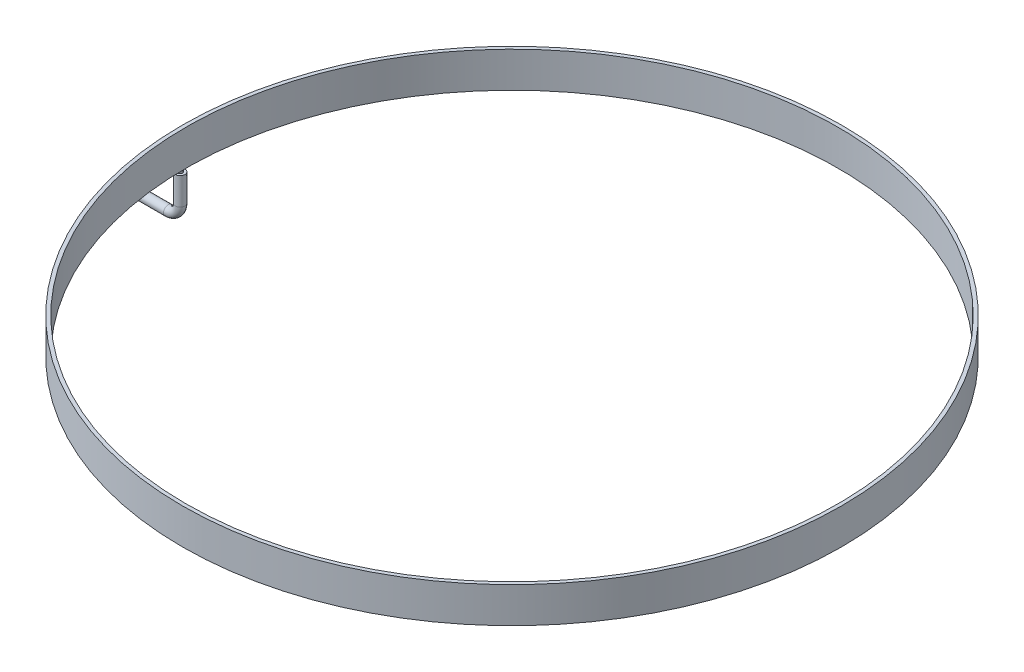
ISO-10303-21;
HEADER;
FILE_DESCRIPTION(('STEP AP214'),'2;1');
FILE_NAME('part.step','',(''),(''),'','','');
FILE_SCHEMA(('AUTOMOTIVE_DESIGN { 1 0 10303 214 1 1 1 1 }'));
ENDSEC;
DATA;
#1=APPLICATION_CONTEXT('core data for automotive mechanical design processes');
#2=APPLICATION_PROTOCOL_DEFINITION('international standard','automotive_design',2000,#1);
#3=PRODUCT_CONTEXT('',#1,'mechanical');
#4=PRODUCT('Part','Part','',(#3));
#5=PRODUCT_RELATED_PRODUCT_CATEGORY('part','',(#4));
#6=PRODUCT_DEFINITION_FORMATION('','',#4);
#7=PRODUCT_DEFINITION_CONTEXT('part definition',#1,'design');
#8=PRODUCT_DEFINITION('design','',#6,#7);
#9=PRODUCT_DEFINITION_SHAPE('','',#8);
#10=(LENGTH_UNIT() NAMED_UNIT(*) SI_UNIT(.MILLI.,.METRE.));
#11=(NAMED_UNIT(*) PLANE_ANGLE_UNIT() SI_UNIT($,.RADIAN.));
#12=(NAMED_UNIT(*) SI_UNIT($,.STERADIAN.) SOLID_ANGLE_UNIT());
#13=UNCERTAINTY_MEASURE_WITH_UNIT(LENGTH_MEASURE(1.E-05),#10,'distance_accuracy_value','');
#14=(GEOMETRIC_REPRESENTATION_CONTEXT(3) GLOBAL_UNCERTAINTY_ASSIGNED_CONTEXT((#13)) GLOBAL_UNIT_ASSIGNED_CONTEXT((#10,
#11,#12)) REPRESENTATION_CONTEXT('',''));
#15=CARTESIAN_POINT('',(0.,0.,0.));
#16=DIRECTION('',(0.,0.,1.));
#17=DIRECTION('',(1.,0.,0.));
#18=AXIS2_PLACEMENT_3D('',#15,#16,#17);
#19=CARTESIAN_POINT('',(-27.98,-1.,0.));
#20=DIRECTION('',(0.,-1.,0.));
#21=DIRECTION('',(0.,0.,-1.));
#22=AXIS2_PLACEMENT_3D('',#19,#20,#21);
#23=PLANE('',#22);
#24=CARTESIAN_POINT('',(-27.98,-1.,0.));
#25=DIRECTION('',(0.,-1.,0.));
#26=DIRECTION('',(0.,0.,-1.));
#27=AXIS2_PLACEMENT_3D('',#24,#25,#26);
#28=CIRCLE('',#27,0.199999999999999);
#29=CARTESIAN_POINT('',(-27.98,-1.,-0.199999999999999));
#30=VERTEX_POINT('',#29);
#31=EDGE_CURVE('E69',#30,#30,#28,.T.);
#32=ORIENTED_EDGE('',*,*,#31,.F.);
#33=EDGE_LOOP('',(#32));
#34=FACE_BOUND('',#33,.T.);
#35=ADVANCED_FACE('F63',(#34),#23,.F.);
#36=CARTESIAN_POINT('',(-27.98,-1.,0.));
#37=DIRECTION('',(0.,-1.,0.));
#38=DIRECTION('',(0.,0.,-1.));
#39=AXIS2_PLACEMENT_3D('',#36,#37,#38);
#40=CYLINDRICAL_SURFACE('',#39,0.199999999999999);
#41=CARTESIAN_POINT('',(-27.98,-2.,0.));
#42=DIRECTION('',(0.,-1.,0.));
#43=DIRECTION('',(0.,0.,-1.));
#44=AXIS2_PLACEMENT_3D('',#41,#42,#43);
#45=CIRCLE('',#44,0.199999999999999);
#46=CARTESIAN_POINT('',(-27.98,-2.,-0.199999999999999));
#47=VERTEX_POINT('',#46);
#48=EDGE_CURVE('E12',#47,#47,#45,.T.);
#49=ORIENTED_EDGE('',*,*,#48,.F.);
#50=EDGE_LOOP('',(#49));
#51=FACE_BOUND('',#50,.T.);
#52=ORIENTED_EDGE('',*,*,#31,.T.);
#53=EDGE_LOOP('',(#52));
#54=FACE_BOUND('',#53,.T.);
#55=ADVANCED_FACE('F106',(#51,#54),#40,.T.);
#56=CARTESIAN_POINT('',(-27.98,-3.,0.));
#57=DIRECTION('',(0.,1.,0.));
#58=DIRECTION('',(0.,0.,1.));
#59=AXIS2_PLACEMENT_3D('',#56,#57,#58);
#60=CYLINDRICAL_SURFACE('',#59,0.400000000000001);
#61=CARTESIAN_POINT('',(-27.98,-2.,0.));
#62=DIRECTION('',(0.,-1.,0.));
#63=DIRECTION('',(0.,0.,-1.));
#64=AXIS2_PLACEMENT_3D('',#61,#62,#63);
#65=CIRCLE('',#64,0.400000000000001);
#66=CARTESIAN_POINT('',(-27.98,-2.,-0.400000000000001));
#67=VERTEX_POINT('',#66);
#68=EDGE_CURVE('E73',#67,#67,#65,.T.);
#69=ORIENTED_EDGE('',*,*,#68,.T.);
#70=EDGE_LOOP('',(#69));
#71=FACE_BOUND('',#70,.T.);
#72=CARTESIAN_POINT('',(-27.98,-4.3,0.));
#73=DIRECTION('',(0.,1.,0.));
#74=DIRECTION('',(0.,0.,-1.));
#75=AXIS2_PLACEMENT_3D('',#72,#73,#74);
#76=CIRCLE('',#75,0.4);
#77=CARTESIAN_POINT('',(-27.58,-4.3,0.));
#78=VERTEX_POINT('',#77);
#79=EDGE_CURVE('E85',#78,#78,#76,.T.);
#80=ORIENTED_EDGE('',*,*,#79,.T.);
#81=EDGE_LOOP('',(#80));
#82=FACE_BOUND('',#81,.T.);
#83=ADVANCED_FACE('F89',(#71,#82),#60,.T.);
#84=CARTESIAN_POINT('',(-27.98,-2.,0.));
#85=DIRECTION('',(0.,-1.,0.));
#86=DIRECTION('',(0.,0.,-1.));
#87=AXIS2_PLACEMENT_3D('',#84,#85,#86);
#88=PLANE('',#87);
#89=ORIENTED_EDGE('',*,*,#48,.T.);
#90=EDGE_LOOP('',(#89));
#91=FACE_BOUND('',#90,.T.);
#92=ORIENTED_EDGE('',*,*,#68,.F.);
#93=EDGE_LOOP('',(#92));
#94=FACE_BOUND('',#93,.T.);
#95=ADVANCED_FACE('F103',(#91,#94),#88,.F.);
#96=CARTESIAN_POINT('',(-32.98,-5.3,0.));
#97=DIRECTION('',(1.,0.,0.));
#98=DIRECTION('',(0.,0.,-1.));
#99=AXIS2_PLACEMENT_3D('',#96,#97,#98);
#100=PLANE('',#99);
#101=CARTESIAN_POINT('',(-32.98,-5.3,0.));
#102=DIRECTION('',(1.,0.,0.));
#103=DIRECTION('',(0.,0.,-1.));
#104=AXIS2_PLACEMENT_3D('',#101,#102,#103);
#105=CIRCLE('',#104,0.4);
#106=CARTESIAN_POINT('',(-32.98,-5.3,-0.4));
#107=VERTEX_POINT('',#106);
#108=EDGE_CURVE('E77',#107,#107,#105,.T.);
#109=ORIENTED_EDGE('',*,*,#108,.F.);
#110=EDGE_LOOP('',(#109));
#111=FACE_BOUND('',#110,.T.);
#112=ADVANCED_FACE('F94',(#111),#100,.F.);
#113=CARTESIAN_POINT('',(-28.98,-4.3,0.));
#114=DIRECTION('',(0.,0.,-1.));
#115=DIRECTION('',(-1.,0.,0.));
#116=AXIS2_PLACEMENT_3D('',#113,#114,#115);
#117=TOROIDAL_SURFACE('',#116,1.,0.4);
#118=CARTESIAN_POINT('',(-28.98,-5.30000000000001,0.));
#119=DIRECTION('',(1.,0.,0.));
#120=DIRECTION('',(0.,0.,-1.));
#121=AXIS2_PLACEMENT_3D('',#118,#119,#120);
#122=CIRCLE('',#121,0.4);
#123=CARTESIAN_POINT('',(-28.98,-5.7,0.));
#124=VERTEX_POINT('',#123);
#125=EDGE_CURVE('E82',#124,#124,#122,.T.);
#126=CARTESIAN_POINT('',(-28.98,-4.3,0.));
#127=DIRECTION('',(0.,0.,-1.));
#128=DIRECTION('',(-1.,0.,0.));
#129=AXIS2_PLACEMENT_3D('',#126,#127,#128);
#130=CIRCLE('',#129,1.4);
#131=EDGE_CURVE('',#78,#124,#130,.T.);
#132=ORIENTED_EDGE('',*,*,#79,.F.);
#133=ORIENTED_EDGE('',*,*,#125,.T.);
#134=ORIENTED_EDGE('',*,*,#131,.T.);
#135=ORIENTED_EDGE('',*,*,#131,.F.);
#136=EDGE_LOOP('',(#132,#134,#133,#135));
#137=FACE_BOUND('',#136,.T.);
#138=ADVANCED_FACE('F91',(#137),#117,.T.);
#139=CARTESIAN_POINT('',(-28.98,-5.3,0.));
#140=DIRECTION('',(-1.,0.,0.));
#141=DIRECTION('',(0.,-1.,0.));
#142=AXIS2_PLACEMENT_3D('',#139,#140,#141);
#143=CYLINDRICAL_SURFACE('',#142,0.4);
#144=ORIENTED_EDGE('',*,*,#108,.T.);
#145=EDGE_LOOP('',(#144));
#146=FACE_BOUND('',#145,.T.);
#147=ORIENTED_EDGE('',*,*,#125,.F.);
#148=EDGE_LOOP('',(#147));
#149=FACE_BOUND('',#148,.T.);
#150=ADVANCED_FACE('F93',(#146,#149),#143,.T.);
#151=CLOSED_SHELL('',(#35,#55,#83,#95,#112,#138,#150));
#152=MANIFOLD_SOLID_BREP('B2',#151);
#153=CARTESIAN_POINT('',(0.,1.5,0.));
#154=DIRECTION('',(0.,1.,0.));
#155=DIRECTION('',(0.,0.,1.));
#156=AXIS2_PLACEMENT_3D('',#153,#154,#155);
#157=PLANE('',#156);
#158=CARTESIAN_POINT('',(0.,1.5,0.));
#159=DIRECTION('',(0.,1.,0.));
#160=DIRECTION('',(0.,0.,1.));
#161=AXIS2_PLACEMENT_3D('',#158,#159,#160);
#162=CIRCLE('',#161,27.8);
#163=CARTESIAN_POINT('',(0.,1.5,27.8));
#164=VERTEX_POINT('',#163);
#165=EDGE_CURVE('E62',#164,#164,#162,.T.);
#166=ORIENTED_EDGE('',*,*,#165,.T.);
#167=EDGE_LOOP('',(#166));
#168=FACE_BOUND('',#167,.T.);
#169=CARTESIAN_POINT('',(0.,1.5,0.));
#170=DIRECTION('',(0.,1.,0.));
#171=DIRECTION('',(0.,0.,1.));
#172=AXIS2_PLACEMENT_3D('',#169,#170,#171);
#173=CIRCLE('',#172,27.5);
#174=CARTESIAN_POINT('',(0.,1.5,27.5));
#175=VERTEX_POINT('',#174);
#176=EDGE_CURVE('E182',#175,#175,#173,.T.);
#177=ORIENTED_EDGE('',*,*,#176,.F.);
#178=EDGE_LOOP('',(#177));
#179=FACE_BOUND('',#178,.T.);
#180=ADVANCED_FACE('F171',(#168,#179),#157,.T.);
#181=CARTESIAN_POINT('',(0.,-1.5,0.));
#182=DIRECTION('',(0.,1.,0.));
#183=DIRECTION('',(0.,0.,1.));
#184=AXIS2_PLACEMENT_3D('',#181,#182,#183);
#185=PLANE('',#184);
#186=CARTESIAN_POINT('',(0.,-1.5,0.));
#187=DIRECTION('',(0.,1.,0.));
#188=DIRECTION('',(0.,0.,1.));
#189=AXIS2_PLACEMENT_3D('',#186,#187,#188);
#190=CIRCLE('',#189,27.8);
#191=CARTESIAN_POINT('',(0.,-1.5,27.8));
#192=VERTEX_POINT('',#191);
#193=EDGE_CURVE('E175',#192,#192,#190,.T.);
#194=ORIENTED_EDGE('',*,*,#193,.F.);
#195=EDGE_LOOP('',(#194));
#196=FACE_BOUND('',#195,.T.);
#197=CARTESIAN_POINT('',(0.,-1.5,0.));
#198=DIRECTION('',(0.,1.,0.));
#199=DIRECTION('',(0.,0.,1.));
#200=AXIS2_PLACEMENT_3D('',#197,#198,#199);
#201=CIRCLE('',#200,27.5);
#202=CARTESIAN_POINT('',(0.,-1.5,27.5));
#203=VERTEX_POINT('',#202);
#204=EDGE_CURVE('E184',#203,#203,#201,.T.);
#205=ORIENTED_EDGE('',*,*,#204,.T.);
#206=EDGE_LOOP('',(#205));
#207=FACE_BOUND('',#206,.T.);
#208=ADVANCED_FACE('F194',(#196,#207),#185,.F.);
#209=CARTESIAN_POINT('',(0.,1.5,0.));
#210=DIRECTION('',(0.,-1.,0.));
#211=DIRECTION('',(0.,0.,-1.));
#212=AXIS2_PLACEMENT_3D('',#209,#210,#211);
#213=CYLINDRICAL_SURFACE('',#212,27.8);
#214=ORIENTED_EDGE('',*,*,#165,.F.);
#215=EDGE_LOOP('',(#214));
#216=FACE_BOUND('',#215,.T.);
#217=ORIENTED_EDGE('',*,*,#193,.T.);
#218=EDGE_LOOP('',(#217));
#219=FACE_BOUND('',#218,.T.);
#220=ADVANCED_FACE('F173',(#216,#219),#213,.T.);
#221=CARTESIAN_POINT('',(0.,1.5,0.));
#222=DIRECTION('',(0.,-1.,0.));
#223=DIRECTION('',(0.,0.,-1.));
#224=AXIS2_PLACEMENT_3D('',#221,#222,#223);
#225=CYLINDRICAL_SURFACE('',#224,27.5);
#226=ORIENTED_EDGE('',*,*,#176,.T.);
#227=EDGE_LOOP('',(#226));
#228=FACE_BOUND('',#227,.T.);
#229=ORIENTED_EDGE('',*,*,#204,.F.);
#230=EDGE_LOOP('',(#229));
#231=FACE_BOUND('',#230,.T.);
#232=ADVANCED_FACE('F190',(#228,#231),#225,.F.);
#233=CLOSED_SHELL('',(#180,#208,#220,#232));
#234=MANIFOLD_SOLID_BREP('B7',#233);
#235=ADVANCED_BREP_SHAPE_REPRESENTATION('',(#18,#152,#234),#14);
#236=SHAPE_DEFINITION_REPRESENTATION(#9,#235);
ENDSEC;
END-ISO-10303-21;
